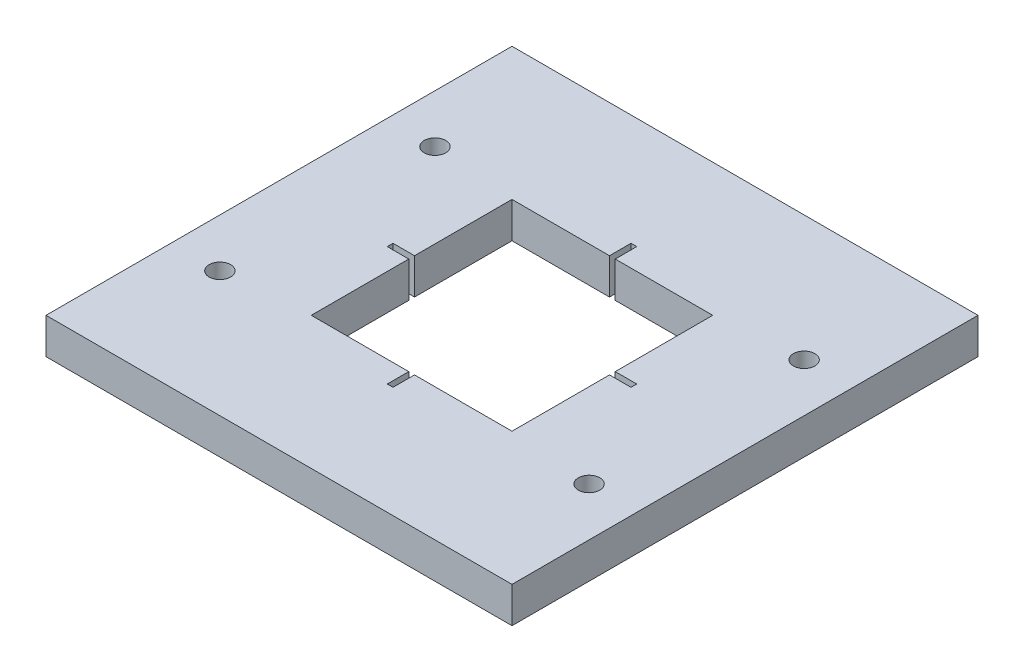
ISO-10303-21;
HEADER;
FILE_DESCRIPTION(('STEP AP214'),'2;1');
FILE_NAME('part.step','',(''),(''),'','','');
FILE_SCHEMA(('AUTOMOTIVE_DESIGN { 1 0 10303 214 1 1 1 1 }'));
ENDSEC;
DATA;
#1=APPLICATION_CONTEXT('core data for automotive mechanical design processes');
#2=APPLICATION_PROTOCOL_DEFINITION('international standard','automotive_design',2000,#1);
#3=PRODUCT_CONTEXT('',#1,'mechanical');
#4=PRODUCT('Part','Part','',(#3));
#5=PRODUCT_RELATED_PRODUCT_CATEGORY('part','',(#4));
#6=PRODUCT_DEFINITION_FORMATION('','',#4);
#7=PRODUCT_DEFINITION_CONTEXT('part definition',#1,'design');
#8=PRODUCT_DEFINITION('design','',#6,#7);
#9=PRODUCT_DEFINITION_SHAPE('','',#8);
#10=(LENGTH_UNIT() NAMED_UNIT(*) SI_UNIT(.MILLI.,.METRE.));
#11=(NAMED_UNIT(*) PLANE_ANGLE_UNIT() SI_UNIT($,.RADIAN.));
#12=(NAMED_UNIT(*) SI_UNIT($,.STERADIAN.) SOLID_ANGLE_UNIT());
#13=UNCERTAINTY_MEASURE_WITH_UNIT(LENGTH_MEASURE(1.E-05),#10,'distance_accuracy_value','');
#14=(GEOMETRIC_REPRESENTATION_CONTEXT(3) GLOBAL_UNCERTAINTY_ASSIGNED_CONTEXT((#13)) GLOBAL_UNIT_ASSIGNED_CONTEXT((#10,
#11,#12)) REPRESENTATION_CONTEXT('',''));
#15=CARTESIAN_POINT('',(0.,0.,0.));
#16=DIRECTION('',(0.,0.,1.));
#17=DIRECTION('',(1.,0.,0.));
#18=AXIS2_PLACEMENT_3D('',#15,#16,#17);
#19=CARTESIAN_POINT('',(0.,5.,0.));
#20=DIRECTION('',(0.,-1.,0.));
#21=DIRECTION('',(0.,0.,-1.));
#22=AXIS2_PLACEMENT_3D('',#19,#20,#21);
#23=PLANE('',#22);
#24=DIRECTION('',(-1.,0.,0.));
#25=VECTOR('',#24,1.);
#26=CARTESIAN_POINT('',(27.9,5.,-41.5));
#27=LINE('',#26,#25);
#28=CARTESIAN_POINT('',(41.5,5.,-41.5));
#29=VERTEX_POINT('',#28);
#30=CARTESIAN_POINT('',(27.9,5.,-41.5));
#31=VERTEX_POINT('',#30);
#32=EDGE_CURVE('E260',#29,#31,#27,.T.);
#33=ORIENTED_EDGE('',*,*,#32,.F.);
#34=DIRECTION('',(0.,0.,-1.));
#35=VECTOR('',#34,1.);
#36=CARTESIAN_POINT('',(41.5,5.,-27.9));
#37=LINE('',#36,#35);
#38=CARTESIAN_POINT('',(41.5,5.,-27.9));
#39=VERTEX_POINT('',#38);
#40=EDGE_CURVE('E299',#39,#29,#37,.T.);
#41=ORIENTED_EDGE('',*,*,#40,.F.);
#42=DIRECTION('',(-1.,0.,0.));
#43=VECTOR('',#42,1.);
#44=CARTESIAN_POINT('',(44.5,5.,-27.9));
#45=LINE('',#44,#43);
#46=CARTESIAN_POINT('',(44.5,5.,-27.9));
#47=VERTEX_POINT('',#46);
#48=EDGE_CURVE('E297',#47,#39,#45,.T.);
#49=ORIENTED_EDGE('',*,*,#48,.F.);
#50=DIRECTION('',(0.,0.,-1.));
#51=VECTOR('',#50,1.);
#52=CARTESIAN_POINT('',(44.5,5.,-27.9));
#53=LINE('',#52,#51);
#54=CARTESIAN_POINT('',(44.5,5.,-27.1));
#55=VERTEX_POINT('',#54);
#56=EDGE_CURVE('E295',#55,#47,#53,.T.);
#57=ORIENTED_EDGE('',*,*,#56,.F.);
#58=DIRECTION('',(1.,0.,0.));
#59=VECTOR('',#58,1.);
#60=CARTESIAN_POINT('',(44.5,5.,-27.1));
#61=LINE('',#60,#59);
#62=CARTESIAN_POINT('',(41.5,5.,-27.1));
#63=VERTEX_POINT('',#62);
#64=EDGE_CURVE('E293',#63,#55,#61,.T.);
#65=ORIENTED_EDGE('',*,*,#64,.F.);
#66=DIRECTION('',(0.,0.,-1.));
#67=VECTOR('',#66,1.);
#68=CARTESIAN_POINT('',(41.5,5.,-13.5));
#69=LINE('',#68,#67);
#70=CARTESIAN_POINT('',(41.5,5.,-13.5));
#71=VERTEX_POINT('',#70);
#72=EDGE_CURVE('E291',#71,#63,#69,.T.);
#73=ORIENTED_EDGE('',*,*,#72,.F.);
#74=DIRECTION('',(1.,0.,0.));
#75=VECTOR('',#74,1.);
#76=CARTESIAN_POINT('',(27.9,5.,-13.5));
#77=LINE('',#76,#75);
#78=CARTESIAN_POINT('',(27.9,5.,-13.5));
#79=VERTEX_POINT('',#78);
#80=EDGE_CURVE('E289',#79,#71,#77,.T.);
#81=ORIENTED_EDGE('',*,*,#80,.F.);
#82=DIRECTION('',(0.,0.,-1.));
#83=VECTOR('',#82,1.);
#84=CARTESIAN_POINT('',(27.9,5.,-10.5));
#85=LINE('',#84,#83);
#86=CARTESIAN_POINT('',(27.9,5.,-10.5));
#87=VERTEX_POINT('',#86);
#88=EDGE_CURVE('E287',#87,#79,#85,.T.);
#89=ORIENTED_EDGE('',*,*,#88,.F.);
#90=DIRECTION('',(1.,0.,0.));
#91=VECTOR('',#90,1.);
#92=CARTESIAN_POINT('',(27.1,5.,-10.5));
#93=LINE('',#92,#91);
#94=CARTESIAN_POINT('',(27.1,5.,-10.5));
#95=VERTEX_POINT('',#94);
#96=EDGE_CURVE('E285',#95,#87,#93,.T.);
#97=ORIENTED_EDGE('',*,*,#96,.F.);
#98=DIRECTION('',(0.,0.,1.));
#99=VECTOR('',#98,1.);
#100=CARTESIAN_POINT('',(27.1,5.,-10.5));
#101=LINE('',#100,#99);
#102=CARTESIAN_POINT('',(27.1,5.,-13.5));
#103=VERTEX_POINT('',#102);
#104=EDGE_CURVE('E283',#103,#95,#101,.T.);
#105=ORIENTED_EDGE('',*,*,#104,.F.);
#106=DIRECTION('',(1.,0.,0.));
#107=VECTOR('',#106,1.);
#108=CARTESIAN_POINT('',(13.5,5.,-13.5));
#109=LINE('',#108,#107);
#110=CARTESIAN_POINT('',(13.5,5.,-13.5));
#111=VERTEX_POINT('',#110);
#112=EDGE_CURVE('E281',#111,#103,#109,.T.);
#113=ORIENTED_EDGE('',*,*,#112,.F.);
#114=DIRECTION('',(0.,0.,1.));
#115=VECTOR('',#114,1.);
#116=CARTESIAN_POINT('',(13.5,5.,-13.5));
#117=LINE('',#116,#115);
#118=CARTESIAN_POINT('',(13.5,5.,-27.1));
#119=VERTEX_POINT('',#118);
#120=EDGE_CURVE('E279',#119,#111,#117,.T.);
#121=ORIENTED_EDGE('',*,*,#120,.F.);
#122=DIRECTION('',(1.,0.,0.));
#123=VECTOR('',#122,1.);
#124=CARTESIAN_POINT('',(10.5,5.,-27.1));
#125=LINE('',#124,#123);
#126=CARTESIAN_POINT('',(10.5,5.,-27.1));
#127=VERTEX_POINT('',#126);
#128=EDGE_CURVE('E277',#127,#119,#125,.T.);
#129=ORIENTED_EDGE('',*,*,#128,.F.);
#130=DIRECTION('',(0.,0.,1.));
#131=VECTOR('',#130,1.);
#132=CARTESIAN_POINT('',(10.5,5.,-27.9));
#133=LINE('',#132,#131);
#134=CARTESIAN_POINT('',(10.5,5.,-27.9));
#135=VERTEX_POINT('',#134);
#136=EDGE_CURVE('E275',#135,#127,#133,.T.);
#137=ORIENTED_EDGE('',*,*,#136,.F.);
#138=DIRECTION('',(-1.,0.,0.));
#139=VECTOR('',#138,1.);
#140=CARTESIAN_POINT('',(10.5,5.,-27.9));
#141=LINE('',#140,#139);
#142=CARTESIAN_POINT('',(13.5,5.,-27.9));
#143=VERTEX_POINT('',#142);
#144=EDGE_CURVE('E273',#143,#135,#141,.T.);
#145=ORIENTED_EDGE('',*,*,#144,.F.);
#146=DIRECTION('',(0.,0.,1.));
#147=VECTOR('',#146,1.);
#148=CARTESIAN_POINT('',(13.5,5.,-27.9));
#149=LINE('',#148,#147);
#150=CARTESIAN_POINT('',(13.5,5.,-41.5));
#151=VERTEX_POINT('',#150);
#152=EDGE_CURVE('E271',#151,#143,#149,.T.);
#153=ORIENTED_EDGE('',*,*,#152,.F.);
#154=DIRECTION('',(-1.,0.,0.));
#155=VECTOR('',#154,1.);
#156=CARTESIAN_POINT('',(13.5,5.,-41.5));
#157=LINE('',#156,#155);
#158=CARTESIAN_POINT('',(27.1,5.,-41.5));
#159=VERTEX_POINT('',#158);
#160=EDGE_CURVE('E269',#159,#151,#157,.T.);
#161=ORIENTED_EDGE('',*,*,#160,.F.);
#162=DIRECTION('',(0.,0.,1.));
#163=VECTOR('',#162,1.);
#164=CARTESIAN_POINT('',(27.1,5.,-44.5));
#165=LINE('',#164,#163);
#166=CARTESIAN_POINT('',(27.1,5.,-44.5));
#167=VERTEX_POINT('',#166);
#168=EDGE_CURVE('E267',#167,#159,#165,.T.);
#169=ORIENTED_EDGE('',*,*,#168,.F.);
#170=DIRECTION('',(-1.,0.,0.));
#171=VECTOR('',#170,1.);
#172=CARTESIAN_POINT('',(27.1,5.,-44.5));
#173=LINE('',#172,#171);
#174=CARTESIAN_POINT('',(27.9,5.,-44.5));
#175=VERTEX_POINT('',#174);
#176=EDGE_CURVE('E265',#175,#167,#173,.T.);
#177=ORIENTED_EDGE('',*,*,#176,.F.);
#178=DIRECTION('',(0.,0.,-1.));
#179=VECTOR('',#178,1.);
#180=CARTESIAN_POINT('',(27.9,5.,-44.5));
#181=LINE('',#180,#179);
#182=EDGE_CURVE('E262',#31,#175,#181,.T.);
#183=ORIENTED_EDGE('',*,*,#182,.F.);
#184=EDGE_LOOP('',(#33,#41,#49,#57,#65,#73,#81,#89,#97,#105,#113,#121,#129,#137,#145,#153,#161,
#169,#177,#183));
#185=FACE_BOUND('',#184,.T.);
#186=CARTESIAN_POINT('',(1.75,5.,-42.5));
#187=DIRECTION('',(0.,1.,0.));
#188=DIRECTION('',(0.,0.,1.));
#189=AXIS2_PLACEMENT_3D('',#186,#187,#188);
#190=CIRCLE('',#189,1.5);
#191=CARTESIAN_POINT('',(1.75,5.,-41.));
#192=VERTEX_POINT('',#191);
#193=EDGE_CURVE('E255',#192,#192,#190,.T.);
#194=ORIENTED_EDGE('',*,*,#193,.F.);
#195=EDGE_LOOP('',(#194));
#196=FACE_BOUND('',#195,.T.);
#197=CARTESIAN_POINT('',(1.75,5.,-12.5));
#198=DIRECTION('',(0.,1.,0.));
#199=DIRECTION('',(0.,0.,1.));
#200=AXIS2_PLACEMENT_3D('',#197,#198,#199);
#201=CIRCLE('',#200,1.5);
#202=CARTESIAN_POINT('',(1.75,5.,-11.));
#203=VERTEX_POINT('',#202);
#204=EDGE_CURVE('E249',#203,#203,#201,.T.);
#205=ORIENTED_EDGE('',*,*,#204,.F.);
#206=EDGE_LOOP('',(#205));
#207=FACE_BOUND('',#206,.T.);
#208=CARTESIAN_POINT('',(53.25,5.,-42.5));
#209=DIRECTION('',(0.,1.,0.));
#210=DIRECTION('',(0.,0.,-1.));
#211=AXIS2_PLACEMENT_3D('',#208,#209,#210);
#212=CIRCLE('',#211,1.5);
#213=CARTESIAN_POINT('',(53.25,5.,-44.));
#214=VERTEX_POINT('',#213);
#215=EDGE_CURVE('E243',#214,#214,#212,.T.);
#216=ORIENTED_EDGE('',*,*,#215,.F.);
#217=EDGE_LOOP('',(#216));
#218=FACE_BOUND('',#217,.T.);
#219=CARTESIAN_POINT('',(53.25,5.,-12.5));
#220=DIRECTION('',(0.,1.,0.));
#221=DIRECTION('',(0.,0.,-1.));
#222=AXIS2_PLACEMENT_3D('',#219,#220,#221);
#223=CIRCLE('',#222,1.5);
#224=CARTESIAN_POINT('',(53.25,5.,-14.));
#225=VERTEX_POINT('',#224);
#226=EDGE_CURVE('E237',#225,#225,#223,.T.);
#227=ORIENTED_EDGE('',*,*,#226,.F.);
#228=EDGE_LOOP('',(#227));
#229=FACE_BOUND('',#228,.T.);
#230=DIRECTION('',(0.,0.,1.));
#231=VECTOR('',#230,1.);
#232=CARTESIAN_POINT('',(-5.00000000000001,5.,4.99999999999999));
#233=LINE('',#232,#231);
#234=CARTESIAN_POINT('',(-4.99999999999999,5.,-60.));
#235=VERTEX_POINT('',#234);
#236=CARTESIAN_POINT('',(-5.00000000000001,5.,4.99999999999999));
#237=VERTEX_POINT('',#236);
#238=EDGE_CURVE('E227',#235,#237,#233,.T.);
#239=ORIENTED_EDGE('',*,*,#238,.T.);
#240=DIRECTION('',(1.,0.,0.));
#241=VECTOR('',#240,1.);
#242=CARTESIAN_POINT('',(-5.00000000000001,5.,4.99999999999999));
#243=LINE('',#242,#241);
#244=CARTESIAN_POINT('',(60.,5.,4.99999999999999));
#245=VERTEX_POINT('',#244);
#246=EDGE_CURVE('E200',#237,#245,#243,.T.);
#247=ORIENTED_EDGE('',*,*,#246,.T.);
#248=DIRECTION('',(0.,0.,-1.));
#249=VECTOR('',#248,1.);
#250=CARTESIAN_POINT('',(60.,5.,4.99999999999999));
#251=LINE('',#250,#249);
#252=CARTESIAN_POINT('',(60.,5.,-60.));
#253=VERTEX_POINT('',#252);
#254=EDGE_CURVE('E222',#245,#253,#251,.T.);
#255=ORIENTED_EDGE('',*,*,#254,.T.);
#256=DIRECTION('',(-1.,0.,0.));
#257=VECTOR('',#256,1.);
#258=CARTESIAN_POINT('',(-4.99999999999999,5.,-60.));
#259=LINE('',#258,#257);
#260=EDGE_CURVE('E219',#253,#235,#259,.T.);
#261=ORIENTED_EDGE('',*,*,#260,.T.);
#262=EDGE_LOOP('',(#239,#247,#255,#261));
#263=FACE_BOUND('',#262,.T.);
#264=ADVANCED_FACE('F33',(#185,#196,#207,#218,#229,#263),#23,.F.);
#265=CARTESIAN_POINT('',(0.,0.,0.));
#266=DIRECTION('',(0.,-1.,0.));
#267=DIRECTION('',(0.,0.,-1.));
#268=AXIS2_PLACEMENT_3D('',#265,#266,#267);
#269=PLANE('',#268);
#270=CARTESIAN_POINT('',(53.25,0.,-42.5));
#271=DIRECTION('',(0.,1.,0.));
#272=DIRECTION('',(0.,0.,-1.));
#273=AXIS2_PLACEMENT_3D('',#270,#271,#272);
#274=CIRCLE('',#273,1.5);
#275=CARTESIAN_POINT('',(53.25,0.,-44.));
#276=VERTEX_POINT('',#275);
#277=EDGE_CURVE('E240',#276,#276,#274,.T.);
#278=ORIENTED_EDGE('',*,*,#277,.T.);
#279=EDGE_LOOP('',(#278));
#280=FACE_BOUND('',#279,.T.);
#281=CARTESIAN_POINT('',(1.75,0.,-42.5));
#282=DIRECTION('',(0.,1.,0.));
#283=DIRECTION('',(0.,0.,1.));
#284=AXIS2_PLACEMENT_3D('',#281,#282,#283);
#285=CIRCLE('',#284,1.5);
#286=CARTESIAN_POINT('',(1.75,0.,-41.));
#287=VERTEX_POINT('',#286);
#288=EDGE_CURVE('E252',#287,#287,#285,.T.);
#289=ORIENTED_EDGE('',*,*,#288,.T.);
#290=EDGE_LOOP('',(#289));
#291=FACE_BOUND('',#290,.T.);
#292=DIRECTION('',(0.,0.,-1.));
#293=VECTOR('',#292,1.);
#294=CARTESIAN_POINT('',(41.5,0.,-27.9));
#295=LINE('',#294,#293);
#296=CARTESIAN_POINT('',(41.5,0.,-27.9));
#297=VERTEX_POINT('',#296);
#298=CARTESIAN_POINT('',(41.5,0.,-41.5));
#299=VERTEX_POINT('',#298);
#300=EDGE_CURVE('E263',#297,#299,#295,.T.);
#301=ORIENTED_EDGE('',*,*,#300,.T.);
#302=DIRECTION('',(-1.,0.,0.));
#303=VECTOR('',#302,1.);
#304=CARTESIAN_POINT('',(27.9,0.,-41.5));
#305=LINE('',#304,#303);
#306=CARTESIAN_POINT('',(27.9,0.,-41.5));
#307=VERTEX_POINT('',#306);
#308=EDGE_CURVE('E55',#299,#307,#305,.T.);
#309=ORIENTED_EDGE('',*,*,#308,.T.);
#310=DIRECTION('',(0.,0.,-1.));
#311=VECTOR('',#310,1.);
#312=CARTESIAN_POINT('',(27.9,0.,-44.5));
#313=LINE('',#312,#311);
#314=CARTESIAN_POINT('',(27.9,0.,-44.5));
#315=VERTEX_POINT('',#314);
#316=EDGE_CURVE('E303',#307,#315,#313,.T.);
#317=ORIENTED_EDGE('',*,*,#316,.T.);
#318=DIRECTION('',(-1.,0.,0.));
#319=VECTOR('',#318,1.);
#320=CARTESIAN_POINT('',(27.1,0.,-44.5));
#321=LINE('',#320,#319);
#322=CARTESIAN_POINT('',(27.1,0.,-44.5));
#323=VERTEX_POINT('',#322);
#324=EDGE_CURVE('E306',#315,#323,#321,.T.);
#325=ORIENTED_EDGE('',*,*,#324,.T.);
#326=DIRECTION('',(0.,0.,1.));
#327=VECTOR('',#326,1.);
#328=CARTESIAN_POINT('',(27.1,0.,-44.5));
#329=LINE('',#328,#327);
#330=CARTESIAN_POINT('',(27.1,0.,-41.5));
#331=VERTEX_POINT('',#330);
#332=EDGE_CURVE('E309',#323,#331,#329,.T.);
#333=ORIENTED_EDGE('',*,*,#332,.T.);
#334=DIRECTION('',(-1.,0.,0.));
#335=VECTOR('',#334,1.);
#336=CARTESIAN_POINT('',(13.5,0.,-41.5));
#337=LINE('',#336,#335);
#338=CARTESIAN_POINT('',(13.5,0.,-41.5));
#339=VERTEX_POINT('',#338);
#340=EDGE_CURVE('E312',#331,#339,#337,.T.);
#341=ORIENTED_EDGE('',*,*,#340,.T.);
#342=DIRECTION('',(0.,0.,1.));
#343=VECTOR('',#342,1.);
#344=CARTESIAN_POINT('',(13.5,0.,-27.9));
#345=LINE('',#344,#343);
#346=CARTESIAN_POINT('',(13.5,0.,-27.9));
#347=VERTEX_POINT('',#346);
#348=EDGE_CURVE('E315',#339,#347,#345,.T.);
#349=ORIENTED_EDGE('',*,*,#348,.T.);
#350=DIRECTION('',(-1.,0.,0.));
#351=VECTOR('',#350,1.);
#352=CARTESIAN_POINT('',(10.5,0.,-27.9));
#353=LINE('',#352,#351);
#354=CARTESIAN_POINT('',(10.5,0.,-27.9));
#355=VERTEX_POINT('',#354);
#356=EDGE_CURVE('E318',#347,#355,#353,.T.);
#357=ORIENTED_EDGE('',*,*,#356,.T.);
#358=DIRECTION('',(0.,0.,1.));
#359=VECTOR('',#358,1.);
#360=CARTESIAN_POINT('',(10.5,0.,-27.9));
#361=LINE('',#360,#359);
#362=CARTESIAN_POINT('',(10.5,0.,-27.1));
#363=VERTEX_POINT('',#362);
#364=EDGE_CURVE('E321',#355,#363,#361,.T.);
#365=ORIENTED_EDGE('',*,*,#364,.T.);
#366=DIRECTION('',(1.,0.,0.));
#367=VECTOR('',#366,1.);
#368=CARTESIAN_POINT('',(10.5,0.,-27.1));
#369=LINE('',#368,#367);
#370=CARTESIAN_POINT('',(13.5,0.,-27.1));
#371=VERTEX_POINT('',#370);
#372=EDGE_CURVE('E324',#363,#371,#369,.T.);
#373=ORIENTED_EDGE('',*,*,#372,.T.);
#374=DIRECTION('',(0.,0.,1.));
#375=VECTOR('',#374,1.);
#376=CARTESIAN_POINT('',(13.5,0.,-13.5));
#377=LINE('',#376,#375);
#378=CARTESIAN_POINT('',(13.5,0.,-13.5));
#379=VERTEX_POINT('',#378);
#380=EDGE_CURVE('E327',#371,#379,#377,.T.);
#381=ORIENTED_EDGE('',*,*,#380,.T.);
#382=DIRECTION('',(1.,0.,0.));
#383=VECTOR('',#382,1.);
#384=CARTESIAN_POINT('',(13.5,0.,-13.5));
#385=LINE('',#384,#383);
#386=CARTESIAN_POINT('',(27.1,0.,-13.5));
#387=VERTEX_POINT('',#386);
#388=EDGE_CURVE('E330',#379,#387,#385,.T.);
#389=ORIENTED_EDGE('',*,*,#388,.T.);
#390=DIRECTION('',(0.,0.,1.));
#391=VECTOR('',#390,1.);
#392=CARTESIAN_POINT('',(27.1,0.,-10.5));
#393=LINE('',#392,#391);
#394=CARTESIAN_POINT('',(27.1,0.,-10.5));
#395=VERTEX_POINT('',#394);
#396=EDGE_CURVE('E333',#387,#395,#393,.T.);
#397=ORIENTED_EDGE('',*,*,#396,.T.);
#398=DIRECTION('',(1.,0.,0.));
#399=VECTOR('',#398,1.);
#400=CARTESIAN_POINT('',(27.1,0.,-10.5));
#401=LINE('',#400,#399);
#402=CARTESIAN_POINT('',(27.9,0.,-10.5));
#403=VERTEX_POINT('',#402);
#404=EDGE_CURVE('E336',#395,#403,#401,.T.);
#405=ORIENTED_EDGE('',*,*,#404,.T.);
#406=DIRECTION('',(0.,0.,-1.));
#407=VECTOR('',#406,1.);
#408=CARTESIAN_POINT('',(27.9,0.,-10.5));
#409=LINE('',#408,#407);
#410=CARTESIAN_POINT('',(27.9,0.,-13.5));
#411=VERTEX_POINT('',#410);
#412=EDGE_CURVE('E339',#403,#411,#409,.T.);
#413=ORIENTED_EDGE('',*,*,#412,.T.);
#414=DIRECTION('',(1.,0.,0.));
#415=VECTOR('',#414,1.);
#416=CARTESIAN_POINT('',(27.9,0.,-13.5));
#417=LINE('',#416,#415);
#418=CARTESIAN_POINT('',(41.5,0.,-13.5));
#419=VERTEX_POINT('',#418);
#420=EDGE_CURVE('E342',#411,#419,#417,.T.);
#421=ORIENTED_EDGE('',*,*,#420,.T.);
#422=DIRECTION('',(0.,0.,-1.));
#423=VECTOR('',#422,1.);
#424=CARTESIAN_POINT('',(41.5,0.,-13.5));
#425=LINE('',#424,#423);
#426=CARTESIAN_POINT('',(41.5,0.,-27.1));
#427=VERTEX_POINT('',#426);
#428=EDGE_CURVE('E345',#419,#427,#425,.T.);
#429=ORIENTED_EDGE('',*,*,#428,.T.);
#430=DIRECTION('',(1.,0.,0.));
#431=VECTOR('',#430,1.);
#432=CARTESIAN_POINT('',(44.5,0.,-27.1));
#433=LINE('',#432,#431);
#434=CARTESIAN_POINT('',(44.5,0.,-27.1));
#435=VERTEX_POINT('',#434);
#436=EDGE_CURVE('E348',#427,#435,#433,.T.);
#437=ORIENTED_EDGE('',*,*,#436,.T.);
#438=DIRECTION('',(0.,0.,-1.));
#439=VECTOR('',#438,1.);
#440=CARTESIAN_POINT('',(44.5,0.,-27.9));
#441=LINE('',#440,#439);
#442=CARTESIAN_POINT('',(44.5,0.,-27.9));
#443=VERTEX_POINT('',#442);
#444=EDGE_CURVE('E351',#435,#443,#441,.T.);
#445=ORIENTED_EDGE('',*,*,#444,.T.);
#446=DIRECTION('',(-1.,0.,0.));
#447=VECTOR('',#446,1.);
#448=CARTESIAN_POINT('',(44.5,0.,-27.9));
#449=LINE('',#448,#447);
#450=EDGE_CURVE('E354',#443,#297,#449,.T.);
#451=ORIENTED_EDGE('',*,*,#450,.T.);
#452=EDGE_LOOP('',(#301,#309,#317,#325,#333,#341,#349,#357,#365,#373,#381,#389,#397,#405,#413,
#421,#429,#437,#445,#451));
#453=FACE_BOUND('',#452,.T.);
#454=CARTESIAN_POINT('',(1.75,0.,-12.5));
#455=DIRECTION('',(0.,1.,0.));
#456=DIRECTION('',(0.,0.,1.));
#457=AXIS2_PLACEMENT_3D('',#454,#455,#456);
#458=CIRCLE('',#457,1.5);
#459=CARTESIAN_POINT('',(1.75,0.,-11.));
#460=VERTEX_POINT('',#459);
#461=EDGE_CURVE('E246',#460,#460,#458,.T.);
#462=ORIENTED_EDGE('',*,*,#461,.T.);
#463=EDGE_LOOP('',(#462));
#464=FACE_BOUND('',#463,.T.);
#465=CARTESIAN_POINT('',(53.25,0.,-12.5));
#466=DIRECTION('',(0.,1.,0.));
#467=DIRECTION('',(0.,0.,-1.));
#468=AXIS2_PLACEMENT_3D('',#465,#466,#467);
#469=CIRCLE('',#468,1.5);
#470=CARTESIAN_POINT('',(53.25,0.,-14.));
#471=VERTEX_POINT('',#470);
#472=EDGE_CURVE('E233',#471,#471,#469,.T.);
#473=ORIENTED_EDGE('',*,*,#472,.T.);
#474=EDGE_LOOP('',(#473));
#475=FACE_BOUND('',#474,.T.);
#476=DIRECTION('',(0.,0.,1.));
#477=VECTOR('',#476,1.);
#478=CARTESIAN_POINT('',(-5.00000000000001,0.,4.99999999999999));
#479=LINE('',#478,#477);
#480=CARTESIAN_POINT('',(-4.99999999999999,0.,-60.));
#481=VERTEX_POINT('',#480);
#482=CARTESIAN_POINT('',(-5.00000000000001,0.,4.99999999999999));
#483=VERTEX_POINT('',#482);
#484=EDGE_CURVE('E212',#481,#483,#479,.T.);
#485=ORIENTED_EDGE('',*,*,#484,.F.);
#486=DIRECTION('',(-1.,0.,0.));
#487=VECTOR('',#486,1.);
#488=CARTESIAN_POINT('',(-4.99999999999999,0.,-60.));
#489=LINE('',#488,#487);
#490=CARTESIAN_POINT('',(60.,0.,-60.));
#491=VERTEX_POINT('',#490);
#492=EDGE_CURVE('E206',#491,#481,#489,.T.);
#493=ORIENTED_EDGE('',*,*,#492,.F.);
#494=DIRECTION('',(0.,0.,-1.));
#495=VECTOR('',#494,1.);
#496=CARTESIAN_POINT('',(60.,0.,4.99999999999999));
#497=LINE('',#496,#495);
#498=CARTESIAN_POINT('',(60.,0.,4.99999999999999));
#499=VERTEX_POINT('',#498);
#500=EDGE_CURVE('E215',#499,#491,#497,.T.);
#501=ORIENTED_EDGE('',*,*,#500,.F.);
#502=DIRECTION('',(1.,0.,0.));
#503=VECTOR('',#502,1.);
#504=CARTESIAN_POINT('',(-5.00000000000001,0.,4.99999999999999));
#505=LINE('',#504,#503);
#506=EDGE_CURVE('E198',#483,#499,#505,.T.);
#507=ORIENTED_EDGE('',*,*,#506,.F.);
#508=EDGE_LOOP('',(#485,#493,#501,#507));
#509=FACE_BOUND('',#508,.T.);
#510=ADVANCED_FACE('F35',(#280,#291,#453,#464,#475,#509),#269,.T.);
#511=CARTESIAN_POINT('',(27.9,5.,-41.5));
#512=DIRECTION('',(0.,0.,1.));
#513=DIRECTION('',(1.,0.,0.));
#514=AXIS2_PLACEMENT_3D('',#511,#512,#513);
#515=PLANE('',#514);
#516=ORIENTED_EDGE('',*,*,#308,.F.);
#517=DIRECTION('',(0.,-1.,0.));
#518=VECTOR('',#517,1.);
#519=CARTESIAN_POINT('',(41.5,5.,-41.5));
#520=LINE('',#519,#518);
#521=EDGE_CURVE('E301',#29,#299,#520,.T.);
#522=ORIENTED_EDGE('',*,*,#521,.F.);
#523=ORIENTED_EDGE('',*,*,#32,.T.);
#524=DIRECTION('',(0.,-1.,0.));
#525=VECTOR('',#524,1.);
#526=CARTESIAN_POINT('',(27.9,5.,-41.5));
#527=LINE('',#526,#525);
#528=EDGE_CURVE('E11',#31,#307,#527,.T.);
#529=ORIENTED_EDGE('',*,*,#528,.T.);
#530=EDGE_LOOP('',(#516,#522,#523,#529));
#531=FACE_BOUND('',#530,.T.);
#532=ADVANCED_FACE('F409',(#531),#515,.T.);
#533=CARTESIAN_POINT('',(27.9,5.,-44.5));
#534=DIRECTION('',(-1.,0.,0.));
#535=DIRECTION('',(0.,0.,1.));
#536=AXIS2_PLACEMENT_3D('',#533,#534,#535);
#537=PLANE('',#536);
#538=ORIENTED_EDGE('',*,*,#316,.F.);
#539=ORIENTED_EDGE('',*,*,#528,.F.);
#540=ORIENTED_EDGE('',*,*,#182,.T.);
#541=DIRECTION('',(0.,-1.,0.));
#542=VECTOR('',#541,1.);
#543=CARTESIAN_POINT('',(27.9,5.,-44.5));
#544=LINE('',#543,#542);
#545=EDGE_CURVE('E41',#175,#315,#544,.T.);
#546=ORIENTED_EDGE('',*,*,#545,.T.);
#547=EDGE_LOOP('',(#538,#539,#540,#546));
#548=FACE_BOUND('',#547,.T.);
#549=ADVANCED_FACE('F395',(#548),#537,.T.);
#550=CARTESIAN_POINT('',(27.1,5.,-44.5));
#551=DIRECTION('',(0.,0.,1.));
#552=DIRECTION('',(1.,0.,0.));
#553=AXIS2_PLACEMENT_3D('',#550,#551,#552);
#554=PLANE('',#553);
#555=ORIENTED_EDGE('',*,*,#324,.F.);
#556=ORIENTED_EDGE('',*,*,#545,.F.);
#557=ORIENTED_EDGE('',*,*,#176,.T.);
#558=DIRECTION('',(0.,-1.,0.));
#559=VECTOR('',#558,1.);
#560=CARTESIAN_POINT('',(27.1,5.,-44.5));
#561=LINE('',#560,#559);
#562=EDGE_CURVE('E391',#167,#323,#561,.T.);
#563=ORIENTED_EDGE('',*,*,#562,.T.);
#564=EDGE_LOOP('',(#555,#556,#557,#563));
#565=FACE_BOUND('',#564,.T.);
#566=ADVANCED_FACE('F400',(#565),#554,.T.);
#567=CARTESIAN_POINT('',(27.1,5.,-44.5));
#568=DIRECTION('',(1.,0.,0.));
#569=DIRECTION('',(0.,0.,-1.));
#570=AXIS2_PLACEMENT_3D('',#567,#568,#569);
#571=PLANE('',#570);
#572=ORIENTED_EDGE('',*,*,#332,.F.);
#573=ORIENTED_EDGE('',*,*,#562,.F.);
#574=ORIENTED_EDGE('',*,*,#168,.T.);
#575=DIRECTION('',(0.,-1.,0.));
#576=VECTOR('',#575,1.);
#577=CARTESIAN_POINT('',(27.1,5.,-41.5));
#578=LINE('',#577,#576);
#579=EDGE_CURVE('E389',#159,#331,#578,.T.);
#580=ORIENTED_EDGE('',*,*,#579,.T.);
#581=EDGE_LOOP('',(#572,#573,#574,#580));
#582=FACE_BOUND('',#581,.T.);
#583=ADVANCED_FACE('F416',(#582),#571,.T.);
#584=CARTESIAN_POINT('',(13.5,5.,-41.5));
#585=DIRECTION('',(0.,0.,1.));
#586=DIRECTION('',(1.,0.,0.));
#587=AXIS2_PLACEMENT_3D('',#584,#585,#586);
#588=PLANE('',#587);
#589=ORIENTED_EDGE('',*,*,#340,.F.);
#590=ORIENTED_EDGE('',*,*,#579,.F.);
#591=ORIENTED_EDGE('',*,*,#160,.T.);
#592=DIRECTION('',(0.,-1.,0.));
#593=VECTOR('',#592,1.);
#594=CARTESIAN_POINT('',(13.5,5.,-41.5));
#595=LINE('',#594,#593);
#596=EDGE_CURVE('E387',#151,#339,#595,.T.);
#597=ORIENTED_EDGE('',*,*,#596,.T.);
#598=EDGE_LOOP('',(#589,#590,#591,#597));
#599=FACE_BOUND('',#598,.T.);
#600=ADVANCED_FACE('F421',(#599),#588,.T.);
#601=CARTESIAN_POINT('',(13.5,5.,-27.9));
#602=DIRECTION('',(1.,0.,0.));
#603=DIRECTION('',(0.,0.,-1.));
#604=AXIS2_PLACEMENT_3D('',#601,#602,#603);
#605=PLANE('',#604);
#606=ORIENTED_EDGE('',*,*,#348,.F.);
#607=ORIENTED_EDGE('',*,*,#596,.F.);
#608=ORIENTED_EDGE('',*,*,#152,.T.);
#609=DIRECTION('',(0.,-1.,0.));
#610=VECTOR('',#609,1.);
#611=CARTESIAN_POINT('',(13.5,5.,-27.9));
#612=LINE('',#611,#610);
#613=EDGE_CURVE('E385',#143,#347,#612,.T.);
#614=ORIENTED_EDGE('',*,*,#613,.T.);
#615=EDGE_LOOP('',(#606,#607,#608,#614));
#616=FACE_BOUND('',#615,.T.);
#617=ADVANCED_FACE('F425',(#616),#605,.T.);
#618=CARTESIAN_POINT('',(10.5,5.,-27.9));
#619=DIRECTION('',(0.,0.,1.));
#620=DIRECTION('',(1.,0.,0.));
#621=AXIS2_PLACEMENT_3D('',#618,#619,#620);
#622=PLANE('',#621);
#623=ORIENTED_EDGE('',*,*,#356,.F.);
#624=ORIENTED_EDGE('',*,*,#613,.F.);
#625=ORIENTED_EDGE('',*,*,#144,.T.);
#626=DIRECTION('',(0.,-1.,0.));
#627=VECTOR('',#626,1.);
#628=CARTESIAN_POINT('',(10.5,5.,-27.9));
#629=LINE('',#628,#627);
#630=EDGE_CURVE('E383',#135,#355,#629,.T.);
#631=ORIENTED_EDGE('',*,*,#630,.T.);
#632=EDGE_LOOP('',(#623,#624,#625,#631));
#633=FACE_BOUND('',#632,.T.);
#634=ADVANCED_FACE('F430',(#633),#622,.T.);
#635=CARTESIAN_POINT('',(10.5,5.,-27.9));
#636=DIRECTION('',(1.,0.,0.));
#637=DIRECTION('',(0.,0.,-1.));
#638=AXIS2_PLACEMENT_3D('',#635,#636,#637);
#639=PLANE('',#638);
#640=ORIENTED_EDGE('',*,*,#364,.F.);
#641=ORIENTED_EDGE('',*,*,#630,.F.);
#642=ORIENTED_EDGE('',*,*,#136,.T.);
#643=DIRECTION('',(0.,-1.,0.));
#644=VECTOR('',#643,1.);
#645=CARTESIAN_POINT('',(10.5,5.,-27.1));
#646=LINE('',#645,#644);
#647=EDGE_CURVE('E381',#127,#363,#646,.T.);
#648=ORIENTED_EDGE('',*,*,#647,.T.);
#649=EDGE_LOOP('',(#640,#641,#642,#648));
#650=FACE_BOUND('',#649,.T.);
#651=ADVANCED_FACE('F435',(#650),#639,.T.);
#652=CARTESIAN_POINT('',(10.5,5.,-27.1));
#653=DIRECTION('',(0.,0.,-1.));
#654=DIRECTION('',(-1.,0.,0.));
#655=AXIS2_PLACEMENT_3D('',#652,#653,#654);
#656=PLANE('',#655);
#657=ORIENTED_EDGE('',*,*,#372,.F.);
#658=ORIENTED_EDGE('',*,*,#647,.F.);
#659=ORIENTED_EDGE('',*,*,#128,.T.);
#660=DIRECTION('',(0.,-1.,0.));
#661=VECTOR('',#660,1.);
#662=CARTESIAN_POINT('',(13.5,5.,-27.1));
#663=LINE('',#662,#661);
#664=EDGE_CURVE('E379',#119,#371,#663,.T.);
#665=ORIENTED_EDGE('',*,*,#664,.T.);
#666=EDGE_LOOP('',(#657,#658,#659,#665));
#667=FACE_BOUND('',#666,.T.);
#668=ADVANCED_FACE('F440',(#667),#656,.T.);
#669=CARTESIAN_POINT('',(13.5,5.,-13.5));
#670=DIRECTION('',(1.,0.,0.));
#671=DIRECTION('',(0.,0.,-1.));
#672=AXIS2_PLACEMENT_3D('',#669,#670,#671);
#673=PLANE('',#672);
#674=ORIENTED_EDGE('',*,*,#380,.F.);
#675=ORIENTED_EDGE('',*,*,#664,.F.);
#676=ORIENTED_EDGE('',*,*,#120,.T.);
#677=DIRECTION('',(0.,-1.,0.));
#678=VECTOR('',#677,1.);
#679=CARTESIAN_POINT('',(13.5,5.,-13.5));
#680=LINE('',#679,#678);
#681=EDGE_CURVE('E377',#111,#379,#680,.T.);
#682=ORIENTED_EDGE('',*,*,#681,.T.);
#683=EDGE_LOOP('',(#674,#675,#676,#682));
#684=FACE_BOUND('',#683,.T.);
#685=ADVANCED_FACE('F445',(#684),#673,.T.);
#686=CARTESIAN_POINT('',(13.5,5.,-13.5));
#687=DIRECTION('',(0.,0.,-1.));
#688=DIRECTION('',(-1.,0.,0.));
#689=AXIS2_PLACEMENT_3D('',#686,#687,#688);
#690=PLANE('',#689);
#691=ORIENTED_EDGE('',*,*,#388,.F.);
#692=ORIENTED_EDGE('',*,*,#681,.F.);
#693=ORIENTED_EDGE('',*,*,#112,.T.);
#694=DIRECTION('',(0.,-1.,0.));
#695=VECTOR('',#694,1.);
#696=CARTESIAN_POINT('',(27.1,5.,-13.5));
#697=LINE('',#696,#695);
#698=EDGE_CURVE('E375',#103,#387,#697,.T.);
#699=ORIENTED_EDGE('',*,*,#698,.T.);
#700=EDGE_LOOP('',(#691,#692,#693,#699));
#701=FACE_BOUND('',#700,.T.);
#702=ADVANCED_FACE('F450',(#701),#690,.T.);
#703=CARTESIAN_POINT('',(27.1,5.,-10.5));
#704=DIRECTION('',(1.,0.,0.));
#705=DIRECTION('',(0.,0.,-1.));
#706=AXIS2_PLACEMENT_3D('',#703,#704,#705);
#707=PLANE('',#706);
#708=ORIENTED_EDGE('',*,*,#396,.F.);
#709=ORIENTED_EDGE('',*,*,#698,.F.);
#710=ORIENTED_EDGE('',*,*,#104,.T.);
#711=DIRECTION('',(0.,-1.,0.));
#712=VECTOR('',#711,1.);
#713=CARTESIAN_POINT('',(27.1,5.,-10.5));
#714=LINE('',#713,#712);
#715=EDGE_CURVE('E373',#95,#395,#714,.T.);
#716=ORIENTED_EDGE('',*,*,#715,.T.);
#717=EDGE_LOOP('',(#708,#709,#710,#716));
#718=FACE_BOUND('',#717,.T.);
#719=ADVANCED_FACE('F455',(#718),#707,.T.);
#720=CARTESIAN_POINT('',(27.1,5.,-10.5));
#721=DIRECTION('',(0.,0.,-1.));
#722=DIRECTION('',(-1.,0.,0.));
#723=AXIS2_PLACEMENT_3D('',#720,#721,#722);
#724=PLANE('',#723);
#725=ORIENTED_EDGE('',*,*,#404,.F.);
#726=ORIENTED_EDGE('',*,*,#715,.F.);
#727=ORIENTED_EDGE('',*,*,#96,.T.);
#728=DIRECTION('',(0.,-1.,0.));
#729=VECTOR('',#728,1.);
#730=CARTESIAN_POINT('',(27.9,5.,-10.5));
#731=LINE('',#730,#729);
#732=EDGE_CURVE('E371',#87,#403,#731,.T.);
#733=ORIENTED_EDGE('',*,*,#732,.T.);
#734=EDGE_LOOP('',(#725,#726,#727,#733));
#735=FACE_BOUND('',#734,.T.);
#736=ADVANCED_FACE('F460',(#735),#724,.T.);
#737=CARTESIAN_POINT('',(27.9,5.,-10.5));
#738=DIRECTION('',(-1.,0.,0.));
#739=DIRECTION('',(0.,0.,1.));
#740=AXIS2_PLACEMENT_3D('',#737,#738,#739);
#741=PLANE('',#740);
#742=ORIENTED_EDGE('',*,*,#412,.F.);
#743=ORIENTED_EDGE('',*,*,#732,.F.);
#744=ORIENTED_EDGE('',*,*,#88,.T.);
#745=DIRECTION('',(0.,-1.,0.));
#746=VECTOR('',#745,1.);
#747=CARTESIAN_POINT('',(27.9,5.,-13.5));
#748=LINE('',#747,#746);
#749=EDGE_CURVE('E369',#79,#411,#748,.T.);
#750=ORIENTED_EDGE('',*,*,#749,.T.);
#751=EDGE_LOOP('',(#742,#743,#744,#750));
#752=FACE_BOUND('',#751,.T.);
#753=ADVANCED_FACE('F465',(#752),#741,.T.);
#754=CARTESIAN_POINT('',(27.9,5.,-13.5));
#755=DIRECTION('',(0.,0.,-1.));
#756=DIRECTION('',(-1.,0.,0.));
#757=AXIS2_PLACEMENT_3D('',#754,#755,#756);
#758=PLANE('',#757);
#759=ORIENTED_EDGE('',*,*,#420,.F.);
#760=ORIENTED_EDGE('',*,*,#749,.F.);
#761=ORIENTED_EDGE('',*,*,#80,.T.);
#762=DIRECTION('',(0.,-1.,0.));
#763=VECTOR('',#762,1.);
#764=CARTESIAN_POINT('',(41.5,5.,-13.5));
#765=LINE('',#764,#763);
#766=EDGE_CURVE('E367',#71,#419,#765,.T.);
#767=ORIENTED_EDGE('',*,*,#766,.T.);
#768=EDGE_LOOP('',(#759,#760,#761,#767));
#769=FACE_BOUND('',#768,.T.);
#770=ADVANCED_FACE('F470',(#769),#758,.T.);
#771=CARTESIAN_POINT('',(41.5,5.,-13.5));
#772=DIRECTION('',(-1.,0.,0.));
#773=DIRECTION('',(0.,0.,1.));
#774=AXIS2_PLACEMENT_3D('',#771,#772,#773);
#775=PLANE('',#774);
#776=ORIENTED_EDGE('',*,*,#428,.F.);
#777=ORIENTED_EDGE('',*,*,#766,.F.);
#778=ORIENTED_EDGE('',*,*,#72,.T.);
#779=DIRECTION('',(0.,-1.,0.));
#780=VECTOR('',#779,1.);
#781=CARTESIAN_POINT('',(41.5,5.,-27.1));
#782=LINE('',#781,#780);
#783=EDGE_CURVE('E365',#63,#427,#782,.T.);
#784=ORIENTED_EDGE('',*,*,#783,.T.);
#785=EDGE_LOOP('',(#776,#777,#778,#784));
#786=FACE_BOUND('',#785,.T.);
#787=ADVANCED_FACE('F475',(#786),#775,.T.);
#788=CARTESIAN_POINT('',(44.5,5.,-27.1));
#789=DIRECTION('',(0.,0.,-1.));
#790=DIRECTION('',(-1.,0.,0.));
#791=AXIS2_PLACEMENT_3D('',#788,#789,#790);
#792=PLANE('',#791);
#793=ORIENTED_EDGE('',*,*,#436,.F.);
#794=ORIENTED_EDGE('',*,*,#783,.F.);
#795=ORIENTED_EDGE('',*,*,#64,.T.);
#796=DIRECTION('',(0.,-1.,0.));
#797=VECTOR('',#796,1.);
#798=CARTESIAN_POINT('',(44.5,5.,-27.1));
#799=LINE('',#798,#797);
#800=EDGE_CURVE('E363',#55,#435,#799,.T.);
#801=ORIENTED_EDGE('',*,*,#800,.T.);
#802=EDGE_LOOP('',(#793,#794,#795,#801));
#803=FACE_BOUND('',#802,.T.);
#804=ADVANCED_FACE('F480',(#803),#792,.T.);
#805=CARTESIAN_POINT('',(44.5,5.,-27.9));
#806=DIRECTION('',(-1.,0.,0.));
#807=DIRECTION('',(0.,0.,1.));
#808=AXIS2_PLACEMENT_3D('',#805,#806,#807);
#809=PLANE('',#808);
#810=ORIENTED_EDGE('',*,*,#444,.F.);
#811=ORIENTED_EDGE('',*,*,#800,.F.);
#812=ORIENTED_EDGE('',*,*,#56,.T.);
#813=DIRECTION('',(0.,-1.,0.));
#814=VECTOR('',#813,1.);
#815=CARTESIAN_POINT('',(44.5,5.,-27.9));
#816=LINE('',#815,#814);
#817=EDGE_CURVE('E361',#47,#443,#816,.T.);
#818=ORIENTED_EDGE('',*,*,#817,.T.);
#819=EDGE_LOOP('',(#810,#811,#812,#818));
#820=FACE_BOUND('',#819,.T.);
#821=ADVANCED_FACE('F485',(#820),#809,.T.);
#822=CARTESIAN_POINT('',(44.5,5.,-27.9));
#823=DIRECTION('',(0.,0.,1.));
#824=DIRECTION('',(1.,0.,0.));
#825=AXIS2_PLACEMENT_3D('',#822,#823,#824);
#826=PLANE('',#825);
#827=ORIENTED_EDGE('',*,*,#450,.F.);
#828=ORIENTED_EDGE('',*,*,#817,.F.);
#829=ORIENTED_EDGE('',*,*,#48,.T.);
#830=DIRECTION('',(0.,-1.,0.));
#831=VECTOR('',#830,1.);
#832=CARTESIAN_POINT('',(41.5,5.,-27.9));
#833=LINE('',#832,#831);
#834=EDGE_CURVE('E48',#39,#297,#833,.T.);
#835=ORIENTED_EDGE('',*,*,#834,.T.);
#836=EDGE_LOOP('',(#827,#828,#829,#835));
#837=FACE_BOUND('',#836,.T.);
#838=ADVANCED_FACE('F488',(#837),#826,.T.);
#839=CARTESIAN_POINT('',(41.5,5.,-27.9));
#840=DIRECTION('',(-1.,0.,0.));
#841=DIRECTION('',(0.,0.,1.));
#842=AXIS2_PLACEMENT_3D('',#839,#840,#841);
#843=PLANE('',#842);
#844=ORIENTED_EDGE('',*,*,#300,.F.);
#845=ORIENTED_EDGE('',*,*,#834,.F.);
#846=ORIENTED_EDGE('',*,*,#40,.T.);
#847=ORIENTED_EDGE('',*,*,#521,.T.);
#848=EDGE_LOOP('',(#844,#845,#846,#847));
#849=FACE_BOUND('',#848,.T.);
#850=ADVANCED_FACE('F406',(#849),#843,.T.);
#851=CARTESIAN_POINT('',(1.75,5.,-42.5));
#852=DIRECTION('',(0.,-1.,0.));
#853=DIRECTION('',(0.,0.,-1.));
#854=AXIS2_PLACEMENT_3D('',#851,#852,#853);
#855=CYLINDRICAL_SURFACE('',#854,1.5);
#856=ORIENTED_EDGE('',*,*,#193,.T.);
#857=EDGE_LOOP('',(#856));
#858=FACE_BOUND('',#857,.T.);
#859=ORIENTED_EDGE('',*,*,#288,.F.);
#860=EDGE_LOOP('',(#859));
#861=FACE_BOUND('',#860,.T.);
#862=ADVANCED_FACE('F495',(#858,#861),#855,.F.);
#863=CARTESIAN_POINT('',(1.75,5.,-12.5));
#864=DIRECTION('',(0.,-1.,0.));
#865=DIRECTION('',(0.,0.,-1.));
#866=AXIS2_PLACEMENT_3D('',#863,#864,#865);
#867=CYLINDRICAL_SURFACE('',#866,1.5);
#868=ORIENTED_EDGE('',*,*,#204,.T.);
#869=EDGE_LOOP('',(#868));
#870=FACE_BOUND('',#869,.T.);
#871=ORIENTED_EDGE('',*,*,#461,.F.);
#872=EDGE_LOOP('',(#871));
#873=FACE_BOUND('',#872,.T.);
#874=ADVANCED_FACE('F564',(#870,#873),#867,.F.);
#875=CARTESIAN_POINT('',(53.25,5.,-42.5));
#876=DIRECTION('',(0.,-1.,0.));
#877=DIRECTION('',(0.,0.,-1.));
#878=AXIS2_PLACEMENT_3D('',#875,#876,#877);
#879=CYLINDRICAL_SURFACE('',#878,1.5);
#880=ORIENTED_EDGE('',*,*,#215,.T.);
#881=EDGE_LOOP('',(#880));
#882=FACE_BOUND('',#881,.T.);
#883=ORIENTED_EDGE('',*,*,#277,.F.);
#884=EDGE_LOOP('',(#883));
#885=FACE_BOUND('',#884,.T.);
#886=ADVANCED_FACE('F574',(#882,#885),#879,.F.);
#887=CARTESIAN_POINT('',(53.25,5.,-12.5));
#888=DIRECTION('',(0.,-1.,0.));
#889=DIRECTION('',(0.,0.,-1.));
#890=AXIS2_PLACEMENT_3D('',#887,#888,#889);
#891=CYLINDRICAL_SURFACE('',#890,1.5);
#892=ORIENTED_EDGE('',*,*,#226,.T.);
#893=EDGE_LOOP('',(#892));
#894=FACE_BOUND('',#893,.T.);
#895=ORIENTED_EDGE('',*,*,#472,.F.);
#896=EDGE_LOOP('',(#895));
#897=FACE_BOUND('',#896,.T.);
#898=ADVANCED_FACE('F584',(#894,#897),#891,.F.);
#899=CARTESIAN_POINT('',(-5.00000000000001,0.,4.99999999999999));
#900=DIRECTION('',(-1.,0.,0.));
#901=DIRECTION('',(0.,0.,1.));
#902=AXIS2_PLACEMENT_3D('',#899,#900,#901);
#903=PLANE('',#902);
#904=ORIENTED_EDGE('',*,*,#238,.F.);
#905=DIRECTION('',(0.,1.,0.));
#906=VECTOR('',#905,1.);
#907=CARTESIAN_POINT('',(-4.99999999999999,0.,-60.));
#908=LINE('',#907,#906);
#909=EDGE_CURVE('E218',#481,#235,#908,.T.);
#910=ORIENTED_EDGE('',*,*,#909,.F.);
#911=ORIENTED_EDGE('',*,*,#484,.T.);
#912=DIRECTION('',(0.,1.,0.));
#913=VECTOR('',#912,1.);
#914=CARTESIAN_POINT('',(-5.00000000000001,0.,4.99999999999999));
#915=LINE('',#914,#913);
#916=EDGE_CURVE('E195',#483,#237,#915,.T.);
#917=ORIENTED_EDGE('',*,*,#916,.T.);
#918=EDGE_LOOP('',(#904,#910,#911,#917));
#919=FACE_BOUND('',#918,.T.);
#920=ADVANCED_FACE('F217',(#919),#903,.T.);
#921=CARTESIAN_POINT('',(-4.99999999999999,0.,-60.));
#922=DIRECTION('',(0.,0.,-1.));
#923=DIRECTION('',(-1.,0.,0.));
#924=AXIS2_PLACEMENT_3D('',#921,#922,#923);
#925=PLANE('',#924);
#926=ORIENTED_EDGE('',*,*,#260,.F.);
#927=DIRECTION('',(0.,1.,0.));
#928=VECTOR('',#927,1.);
#929=CARTESIAN_POINT('',(60.,0.,-60.));
#930=LINE('',#929,#928);
#931=EDGE_CURVE('E234',#491,#253,#930,.T.);
#932=ORIENTED_EDGE('',*,*,#931,.F.);
#933=ORIENTED_EDGE('',*,*,#492,.T.);
#934=ORIENTED_EDGE('',*,*,#909,.T.);
#935=EDGE_LOOP('',(#926,#932,#933,#934));
#936=FACE_BOUND('',#935,.T.);
#937=ADVANCED_FACE('F615',(#936),#925,.T.);
#938=CARTESIAN_POINT('',(60.,0.,4.99999999999999));
#939=DIRECTION('',(1.,0.,0.));
#940=DIRECTION('',(0.,0.,-1.));
#941=AXIS2_PLACEMENT_3D('',#938,#939,#940);
#942=PLANE('',#941);
#943=ORIENTED_EDGE('',*,*,#254,.F.);
#944=DIRECTION('',(0.,1.,0.));
#945=VECTOR('',#944,1.);
#946=CARTESIAN_POINT('',(60.,0.,4.99999999999999));
#947=LINE('',#946,#945);
#948=EDGE_CURVE('E205',#499,#245,#947,.T.);
#949=ORIENTED_EDGE('',*,*,#948,.F.);
#950=ORIENTED_EDGE('',*,*,#500,.T.);
#951=ORIENTED_EDGE('',*,*,#931,.T.);
#952=EDGE_LOOP('',(#943,#949,#950,#951));
#953=FACE_BOUND('',#952,.T.);
#954=ADVANCED_FACE('F624',(#953),#942,.T.);
#955=CARTESIAN_POINT('',(-5.00000000000001,0.,4.99999999999999));
#956=DIRECTION('',(0.,0.,1.));
#957=DIRECTION('',(1.,0.,0.));
#958=AXIS2_PLACEMENT_3D('',#955,#956,#957);
#959=PLANE('',#958);
#960=ORIENTED_EDGE('',*,*,#246,.F.);
#961=ORIENTED_EDGE('',*,*,#916,.F.);
#962=ORIENTED_EDGE('',*,*,#506,.T.);
#963=ORIENTED_EDGE('',*,*,#948,.T.);
#964=EDGE_LOOP('',(#960,#961,#962,#963));
#965=FACE_BOUND('',#964,.T.);
#966=ADVANCED_FACE('F197',(#965),#959,.T.);
#967=CLOSED_SHELL('',(#264,#510,#532,#549,#566,#583,#600,#617,#634,#651,#668,#685,#702,#719,
#736,#753,#770,#787,#804,#821,#838,#850,#862,#874,#886,#898,#920,#937,#954,#966));
#968=MANIFOLD_SOLID_BREP('B2',#967);
#969=ADVANCED_BREP_SHAPE_REPRESENTATION('',(#18,#968),#14);
#970=SHAPE_DEFINITION_REPRESENTATION(#9,#969);
ENDSEC;
END-ISO-10303-21;
